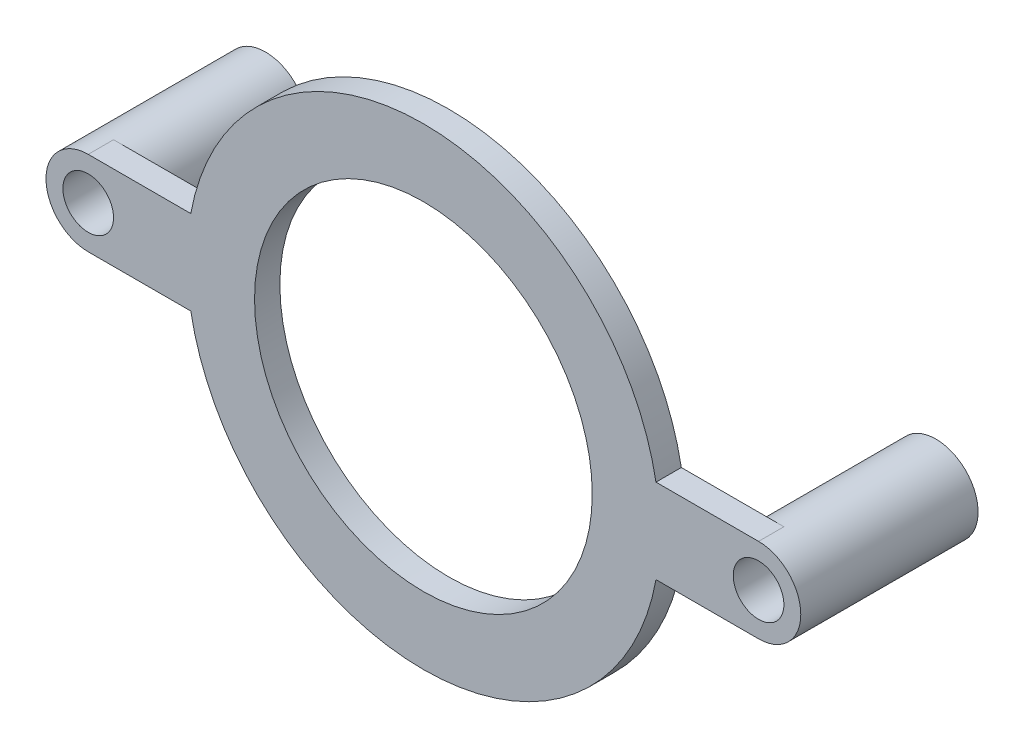
ISO-10303-21;
HEADER;
FILE_DESCRIPTION(('STEP AP214'),'2;1');
FILE_NAME('part.step','',(''),(''),'','','');
FILE_SCHEMA(('AUTOMOTIVE_DESIGN { 1 0 10303 214 1 1 1 1 }'));
ENDSEC;
DATA;
#1=APPLICATION_CONTEXT('core data for automotive mechanical design processes');
#2=APPLICATION_PROTOCOL_DEFINITION('international standard','automotive_design',2000,#1);
#3=PRODUCT_CONTEXT('',#1,'mechanical');
#4=PRODUCT('Part','Part','',(#3));
#5=PRODUCT_RELATED_PRODUCT_CATEGORY('part','',(#4));
#6=PRODUCT_DEFINITION_FORMATION('','',#4);
#7=PRODUCT_DEFINITION_CONTEXT('part definition',#1,'design');
#8=PRODUCT_DEFINITION('design','',#6,#7);
#9=PRODUCT_DEFINITION_SHAPE('','',#8);
#10=(LENGTH_UNIT() NAMED_UNIT(*) SI_UNIT(.MILLI.,.METRE.));
#11=(NAMED_UNIT(*) PLANE_ANGLE_UNIT() SI_UNIT($,.RADIAN.));
#12=(NAMED_UNIT(*) SI_UNIT($,.STERADIAN.) SOLID_ANGLE_UNIT());
#13=UNCERTAINTY_MEASURE_WITH_UNIT(LENGTH_MEASURE(1.E-05),#10,'distance_accuracy_value','');
#14=(GEOMETRIC_REPRESENTATION_CONTEXT(3) GLOBAL_UNCERTAINTY_ASSIGNED_CONTEXT((#13)) GLOBAL_UNIT_ASSIGNED_CONTEXT((#10,
#11,#12)) REPRESENTATION_CONTEXT('',''));
#15=CARTESIAN_POINT('',(0.,0.,0.));
#16=DIRECTION('',(0.,0.,1.));
#17=DIRECTION('',(1.,0.,0.));
#18=AXIS2_PLACEMENT_3D('',#15,#16,#17);
#19=CARTESIAN_POINT('',(19.85,0.,1.5));
#20=DIRECTION('',(0.,0.,-1.));
#21=DIRECTION('',(-1.,0.,0.));
#22=AXIS2_PLACEMENT_3D('',#19,#20,#21);
#23=CYLINDRICAL_SURFACE('',#22,2.5);
#24=DIRECTION('',(0.,0.,-1.));
#25=VECTOR('',#24,1.);
#26=CARTESIAN_POINT('',(19.85,-2.5,1.5));
#27=LINE('',#26,#25);
#28=CARTESIAN_POINT('',(19.85,-2.5,1.5));
#29=VERTEX_POINT('',#28);
#30=CARTESIAN_POINT('',(19.85,-2.5,0.));
#31=VERTEX_POINT('',#30);
#32=EDGE_CURVE('E115',#29,#31,#27,.T.);
#33=ORIENTED_EDGE('',*,*,#32,.T.);
#34=CARTESIAN_POINT('',(19.85,0.,0.));
#35=DIRECTION('',(0.,0.,-1.));
#36=DIRECTION('',(-1.,0.,0.));
#37=AXIS2_PLACEMENT_3D('',#34,#35,#36);
#38=CIRCLE('',#37,2.5);
#39=CARTESIAN_POINT('',(19.85,2.5,0.));
#40=VERTEX_POINT('',#39);
#41=EDGE_CURVE('E11',#31,#40,#38,.T.);
#42=ORIENTED_EDGE('',*,*,#41,.T.);
#43=DIRECTION('',(0.,0.,-1.));
#44=VECTOR('',#43,1.);
#45=CARTESIAN_POINT('',(19.85,2.5,1.5));
#46=LINE('',#45,#44);
#47=CARTESIAN_POINT('',(19.85,2.5,1.5));
#48=VERTEX_POINT('',#47);
#49=EDGE_CURVE('E107',#48,#40,#46,.T.);
#50=ORIENTED_EDGE('',*,*,#49,.F.);
#51=CARTESIAN_POINT('',(19.85,0.,1.5));
#52=DIRECTION('',(0.,0.,-1.));
#53=DIRECTION('',(-1.,0.,0.));
#54=AXIS2_PLACEMENT_3D('',#51,#52,#53);
#55=CIRCLE('',#54,2.5);
#56=EDGE_CURVE('E110',#48,#29,#55,.T.);
#57=ORIENTED_EDGE('',*,*,#56,.T.);
#58=EDGE_LOOP('',(#33,#42,#50,#57));
#59=FACE_BOUND('',#58,.T.);
#60=CARTESIAN_POINT('',(19.85,0.,-9.00000000000001));
#61=DIRECTION('',(0.,0.,-1.));
#62=DIRECTION('',(-1.,0.,0.));
#63=AXIS2_PLACEMENT_3D('',#60,#61,#62);
#64=CIRCLE('',#63,2.5);
#65=CARTESIAN_POINT('',(17.35,0.,-9.00000000000001));
#66=VERTEX_POINT('',#65);
#67=EDGE_CURVE('E170',#66,#66,#64,.T.);
#68=ORIENTED_EDGE('',*,*,#67,.F.);
#69=EDGE_LOOP('',(#68));
#70=FACE_BOUND('',#69,.T.);
#71=ADVANCED_FACE('F35',(#59,#70),#23,.T.);
#72=CARTESIAN_POINT('',(-19.85,0.,1.5));
#73=DIRECTION('',(0.,0.,-1.));
#74=DIRECTION('',(-1.,0.,0.));
#75=AXIS2_PLACEMENT_3D('',#72,#73,#74);
#76=CYLINDRICAL_SURFACE('',#75,2.5);
#77=DIRECTION('',(0.,0.,-1.));
#78=VECTOR('',#77,1.);
#79=CARTESIAN_POINT('',(-19.85,2.5,1.5));
#80=LINE('',#79,#78);
#81=CARTESIAN_POINT('',(-19.85,2.5,1.5));
#82=VERTEX_POINT('',#81);
#83=CARTESIAN_POINT('',(-19.85,2.5,0.));
#84=VERTEX_POINT('',#83);
#85=EDGE_CURVE('E157',#82,#84,#80,.T.);
#86=ORIENTED_EDGE('',*,*,#85,.T.);
#87=CARTESIAN_POINT('',(-19.85,0.,0.));
#88=DIRECTION('',(0.,0.,-1.));
#89=DIRECTION('',(-1.,0.,0.));
#90=AXIS2_PLACEMENT_3D('',#87,#88,#89);
#91=CIRCLE('',#90,2.5);
#92=CARTESIAN_POINT('',(-19.85,-2.5,0.));
#93=VERTEX_POINT('',#92);
#94=EDGE_CURVE('E138',#84,#93,#91,.T.);
#95=ORIENTED_EDGE('',*,*,#94,.T.);
#96=DIRECTION('',(0.,0.,-1.));
#97=VECTOR('',#96,1.);
#98=CARTESIAN_POINT('',(-19.85,-2.5,1.5));
#99=LINE('',#98,#97);
#100=CARTESIAN_POINT('',(-19.85,-2.5,1.5));
#101=VERTEX_POINT('',#100);
#102=EDGE_CURVE('E160',#101,#93,#99,.T.);
#103=ORIENTED_EDGE('',*,*,#102,.F.);
#104=CARTESIAN_POINT('',(-19.85,0.,1.5));
#105=DIRECTION('',(0.,0.,-1.));
#106=DIRECTION('',(-1.,0.,0.));
#107=AXIS2_PLACEMENT_3D('',#104,#105,#106);
#108=CIRCLE('',#107,2.5);
#109=EDGE_CURVE('E193',#101,#82,#108,.T.);
#110=ORIENTED_EDGE('',*,*,#109,.T.);
#111=EDGE_LOOP('',(#86,#95,#103,#110));
#112=FACE_BOUND('',#111,.T.);
#113=CARTESIAN_POINT('',(-19.85,0.,-9.00000000000001));
#114=DIRECTION('',(0.,0.,-1.));
#115=DIRECTION('',(-1.,0.,0.));
#116=AXIS2_PLACEMENT_3D('',#113,#114,#115);
#117=CIRCLE('',#116,2.5);
#118=CARTESIAN_POINT('',(-22.35,0.,-9.00000000000001));
#119=VERTEX_POINT('',#118);
#120=EDGE_CURVE('E164',#119,#119,#117,.T.);
#121=ORIENTED_EDGE('',*,*,#120,.F.);
#122=EDGE_LOOP('',(#121));
#123=FACE_BOUND('',#122,.T.);
#124=ADVANCED_FACE('F203',(#112,#123),#76,.T.);
#125=CARTESIAN_POINT('',(-19.85,0.,-22.));
#126=DIRECTION('',(0.,0.,-1.));
#127=DIRECTION('',(-1.,0.,0.));
#128=AXIS2_PLACEMENT_3D('',#125,#126,#127);
#129=CYLINDRICAL_SURFACE('',#128,1.49999999999999);
#130=CARTESIAN_POINT('',(-19.85,0.,1.5));
#131=DIRECTION('',(0.,0.,-1.));
#132=DIRECTION('',(-1.,0.,0.));
#133=AXIS2_PLACEMENT_3D('',#130,#131,#132);
#134=CIRCLE('',#133,1.49999999999999);
#135=CARTESIAN_POINT('',(-21.35,0.,1.5));
#136=VERTEX_POINT('',#135);
#137=EDGE_CURVE('E185',#136,#136,#134,.T.);
#138=ORIENTED_EDGE('',*,*,#137,.F.);
#139=EDGE_LOOP('',(#138));
#140=FACE_BOUND('',#139,.T.);
#141=CARTESIAN_POINT('',(-19.85,0.,-9.00000000000001));
#142=DIRECTION('',(0.,0.,-1.));
#143=DIRECTION('',(-1.,0.,0.));
#144=AXIS2_PLACEMENT_3D('',#141,#142,#143);
#145=CIRCLE('',#144,1.49999999999999);
#146=CARTESIAN_POINT('',(-21.35,0.,-9.00000000000001));
#147=VERTEX_POINT('',#146);
#148=EDGE_CURVE('E39',#147,#147,#145,.F.);
#149=ORIENTED_EDGE('',*,*,#148,.F.);
#150=EDGE_LOOP('',(#149));
#151=FACE_BOUND('',#150,.T.);
#152=ADVANCED_FACE('F224',(#140,#151),#129,.F.);
#153=CARTESIAN_POINT('',(19.85,0.,-22.));
#154=DIRECTION('',(0.,0.,-1.));
#155=DIRECTION('',(-1.,0.,0.));
#156=AXIS2_PLACEMENT_3D('',#153,#154,#155);
#157=CYLINDRICAL_SURFACE('',#156,1.49999999999999);
#158=CARTESIAN_POINT('',(19.85,0.,1.5));
#159=DIRECTION('',(0.,0.,-1.));
#160=DIRECTION('',(-1.,0.,0.));
#161=AXIS2_PLACEMENT_3D('',#158,#159,#160);
#162=CIRCLE('',#161,1.49999999999999);
#163=CARTESIAN_POINT('',(18.35,0.,1.5));
#164=VERTEX_POINT('',#163);
#165=EDGE_CURVE('E182',#164,#164,#162,.T.);
#166=ORIENTED_EDGE('',*,*,#165,.F.);
#167=EDGE_LOOP('',(#166));
#168=FACE_BOUND('',#167,.T.);
#169=CARTESIAN_POINT('',(19.85,0.,-9.00000000000001));
#170=DIRECTION('',(0.,0.,-1.));
#171=DIRECTION('',(-1.,0.,0.));
#172=AXIS2_PLACEMENT_3D('',#169,#170,#171);
#173=CIRCLE('',#172,1.49999999999999);
#174=CARTESIAN_POINT('',(18.35,0.,-9.00000000000001));
#175=VERTEX_POINT('',#174);
#176=EDGE_CURVE('E162',#175,#175,#173,.F.);
#177=ORIENTED_EDGE('',*,*,#176,.F.);
#178=EDGE_LOOP('',(#177));
#179=FACE_BOUND('',#178,.T.);
#180=ADVANCED_FACE('F249',(#168,#179),#157,.F.);
#181=CARTESIAN_POINT('',(0.,0.,0.));
#182=DIRECTION('',(0.,0.,-1.));
#183=DIRECTION('',(-1.,0.,0.));
#184=AXIS2_PLACEMENT_3D('',#181,#182,#183);
#185=PLANE('',#184);
#186=CARTESIAN_POINT('',(2.22044604925031E-13,0.,0.));
#187=DIRECTION('',(0.,0.,-1.));
#188=DIRECTION('',(-1.,0.,0.));
#189=AXIS2_PLACEMENT_3D('',#186,#187,#188);
#190=CIRCLE('',#189,9.99999999999977);
#191=CARTESIAN_POINT('',(-9.99999999999954,0.,0.));
#192=VERTEX_POINT('',#191);
#193=EDGE_CURVE('E179',#192,#192,#190,.T.);
#194=ORIENTED_EDGE('',*,*,#193,.F.);
#195=EDGE_LOOP('',(#194));
#196=FACE_BOUND('',#195,.T.);
#197=DIRECTION('',(-1.,0.,0.));
#198=VECTOR('',#197,1.);
#199=CARTESIAN_POINT('',(-13.7749773139559,-2.5,0.));
#200=LINE('',#199,#198);
#201=CARTESIAN_POINT('',(-13.7749773139559,-2.5,0.));
#202=VERTEX_POINT('',#201);
#203=EDGE_CURVE('E137',#202,#93,#200,.T.);
#204=ORIENTED_EDGE('',*,*,#203,.T.);
#205=ORIENTED_EDGE('',*,*,#94,.F.);
#206=DIRECTION('',(1.,0.,0.));
#207=VECTOR('',#206,1.);
#208=CARTESIAN_POINT('',(-19.85,2.5,0.));
#209=LINE('',#208,#207);
#210=CARTESIAN_POINT('',(-13.7749773139559,2.5,0.));
#211=VERTEX_POINT('',#210);
#212=EDGE_CURVE('E141',#84,#211,#209,.T.);
#213=ORIENTED_EDGE('',*,*,#212,.T.);
#214=CARTESIAN_POINT('',(0.,0.,0.));
#215=DIRECTION('',(0.,0.,-1.));
#216=DIRECTION('',(-1.,0.,0.));
#217=AXIS2_PLACEMENT_3D('',#214,#215,#216);
#218=CIRCLE('',#217,14.);
#219=CARTESIAN_POINT('',(13.7749773139559,2.5,0.));
#220=VERTEX_POINT('',#219);
#221=EDGE_CURVE('E144',#211,#220,#218,.T.);
#222=ORIENTED_EDGE('',*,*,#221,.T.);
#223=DIRECTION('',(1.,0.,0.));
#224=VECTOR('',#223,1.);
#225=CARTESIAN_POINT('',(13.7749773139559,2.5,0.));
#226=LINE('',#225,#224);
#227=EDGE_CURVE('E147',#220,#40,#226,.T.);
#228=ORIENTED_EDGE('',*,*,#227,.T.);
#229=ORIENTED_EDGE('',*,*,#41,.F.);
#230=DIRECTION('',(-1.,0.,0.));
#231=VECTOR('',#230,1.);
#232=CARTESIAN_POINT('',(19.85,-2.5,0.));
#233=LINE('',#232,#231);
#234=CARTESIAN_POINT('',(13.7749773139559,-2.5,0.));
#235=VERTEX_POINT('',#234);
#236=EDGE_CURVE('E149',#31,#235,#233,.T.);
#237=ORIENTED_EDGE('',*,*,#236,.T.);
#238=CARTESIAN_POINT('',(0.,0.,0.));
#239=DIRECTION('',(0.,0.,-1.));
#240=DIRECTION('',(-1.,0.,0.));
#241=AXIS2_PLACEMENT_3D('',#238,#239,#240);
#242=CIRCLE('',#241,14.);
#243=EDGE_CURVE('E134',#235,#202,#242,.T.);
#244=ORIENTED_EDGE('',*,*,#243,.T.);
#245=EDGE_LOOP('',(#204,#205,#213,#222,#228,#229,#237,#244));
#246=FACE_BOUND('',#245,.T.);
#247=ADVANCED_FACE('F208',(#196,#246),#185,.T.);
#248=CARTESIAN_POINT('',(0.,0.,1.5));
#249=DIRECTION('',(0.,0.,-1.));
#250=DIRECTION('',(-1.,0.,0.));
#251=AXIS2_PLACEMENT_3D('',#248,#249,#250);
#252=CYLINDRICAL_SURFACE('',#251,14.);
#253=ORIENTED_EDGE('',*,*,#243,.F.);
#254=DIRECTION('',(0.,0.,-1.));
#255=VECTOR('',#254,1.);
#256=CARTESIAN_POINT('',(13.7749773139559,-2.5,1.5));
#257=LINE('',#256,#255);
#258=CARTESIAN_POINT('',(13.7749773139559,-2.5,1.5));
#259=VERTEX_POINT('',#258);
#260=EDGE_CURVE('E45',#259,#235,#257,.T.);
#261=ORIENTED_EDGE('',*,*,#260,.F.);
#262=CARTESIAN_POINT('',(0.,0.,1.5));
#263=DIRECTION('',(0.,0.,-1.));
#264=DIRECTION('',(-1.,0.,0.));
#265=AXIS2_PLACEMENT_3D('',#262,#263,#264);
#266=CIRCLE('',#265,14.);
#267=CARTESIAN_POINT('',(-13.7749773139559,-2.5,1.5));
#268=VERTEX_POINT('',#267);
#269=EDGE_CURVE('E151',#259,#268,#266,.T.);
#270=ORIENTED_EDGE('',*,*,#269,.T.);
#271=DIRECTION('',(0.,0.,-1.));
#272=VECTOR('',#271,1.);
#273=CARTESIAN_POINT('',(-13.7749773139559,-2.5,1.5));
#274=LINE('',#273,#272);
#275=EDGE_CURVE('E88',#268,#202,#274,.T.);
#276=ORIENTED_EDGE('',*,*,#275,.T.);
#277=EDGE_LOOP('',(#253,#261,#270,#276));
#278=FACE_BOUND('',#277,.T.);
#279=ADVANCED_FACE('F37',(#278),#252,.T.);
#280=CARTESIAN_POINT('',(19.85,-2.5,1.5));
#281=DIRECTION('',(0.,-1.,0.));
#282=DIRECTION('',(0.,0.,-1.));
#283=AXIS2_PLACEMENT_3D('',#280,#281,#282);
#284=PLANE('',#283);
#285=ORIENTED_EDGE('',*,*,#236,.F.);
#286=ORIENTED_EDGE('',*,*,#32,.F.);
#287=DIRECTION('',(-1.,0.,0.));
#288=VECTOR('',#287,1.);
#289=CARTESIAN_POINT('',(19.85,-2.5,1.5));
#290=LINE('',#289,#288);
#291=EDGE_CURVE('E124',#29,#259,#290,.T.);
#292=ORIENTED_EDGE('',*,*,#291,.T.);
#293=ORIENTED_EDGE('',*,*,#260,.T.);
#294=EDGE_LOOP('',(#285,#286,#292,#293));
#295=FACE_BOUND('',#294,.T.);
#296=ADVANCED_FACE('F209',(#295),#284,.T.);
#297=CARTESIAN_POINT('',(13.7749773139559,2.5,1.5));
#298=DIRECTION('',(0.,1.,0.));
#299=DIRECTION('',(0.,0.,1.));
#300=AXIS2_PLACEMENT_3D('',#297,#298,#299);
#301=PLANE('',#300);
#302=ORIENTED_EDGE('',*,*,#227,.F.);
#303=DIRECTION('',(0.,0.,-1.));
#304=VECTOR('',#303,1.);
#305=CARTESIAN_POINT('',(13.7749773139559,2.5,1.5));
#306=LINE('',#305,#304);
#307=CARTESIAN_POINT('',(13.7749773139559,2.5,1.5));
#308=VERTEX_POINT('',#307);
#309=EDGE_CURVE('E116',#308,#220,#306,.T.);
#310=ORIENTED_EDGE('',*,*,#309,.F.);
#311=DIRECTION('',(1.,0.,0.));
#312=VECTOR('',#311,1.);
#313=CARTESIAN_POINT('',(13.7749773139559,2.5,1.5));
#314=LINE('',#313,#312);
#315=EDGE_CURVE('E122',#308,#48,#314,.T.);
#316=ORIENTED_EDGE('',*,*,#315,.T.);
#317=ORIENTED_EDGE('',*,*,#49,.T.);
#318=EDGE_LOOP('',(#302,#310,#316,#317));
#319=FACE_BOUND('',#318,.T.);
#320=ADVANCED_FACE('F126',(#319),#301,.T.);
#321=CARTESIAN_POINT('',(0.,0.,1.5));
#322=DIRECTION('',(0.,0.,-1.));
#323=DIRECTION('',(-1.,0.,0.));
#324=AXIS2_PLACEMENT_3D('',#321,#322,#323);
#325=CYLINDRICAL_SURFACE('',#324,14.);
#326=ORIENTED_EDGE('',*,*,#221,.F.);
#327=DIRECTION('',(0.,0.,-1.));
#328=VECTOR('',#327,1.);
#329=CARTESIAN_POINT('',(-13.7749773139559,2.5,1.5));
#330=LINE('',#329,#328);
#331=CARTESIAN_POINT('',(-13.7749773139559,2.5,1.5));
#332=VERTEX_POINT('',#331);
#333=EDGE_CURVE('E155',#332,#211,#330,.T.);
#334=ORIENTED_EDGE('',*,*,#333,.F.);
#335=CARTESIAN_POINT('',(0.,0.,1.5));
#336=DIRECTION('',(0.,0.,-1.));
#337=DIRECTION('',(-1.,0.,0.));
#338=AXIS2_PLACEMENT_3D('',#335,#336,#337);
#339=CIRCLE('',#338,14.);
#340=EDGE_CURVE('E127',#332,#308,#339,.T.);
#341=ORIENTED_EDGE('',*,*,#340,.T.);
#342=ORIENTED_EDGE('',*,*,#309,.T.);
#343=EDGE_LOOP('',(#326,#334,#341,#342));
#344=FACE_BOUND('',#343,.T.);
#345=ADVANCED_FACE('F216',(#344),#325,.T.);
#346=CARTESIAN_POINT('',(-19.85,2.5,1.5));
#347=DIRECTION('',(0.,1.,0.));
#348=DIRECTION('',(-1.,0.,0.));
#349=AXIS2_PLACEMENT_3D('',#346,#347,#348);
#350=PLANE('',#349);
#351=ORIENTED_EDGE('',*,*,#212,.F.);
#352=ORIENTED_EDGE('',*,*,#85,.F.);
#353=DIRECTION('',(1.,0.,0.));
#354=VECTOR('',#353,1.);
#355=CARTESIAN_POINT('',(-19.85,2.5,1.5));
#356=LINE('',#355,#354);
#357=EDGE_CURVE('E129',#82,#332,#356,.T.);
#358=ORIENTED_EDGE('',*,*,#357,.T.);
#359=ORIENTED_EDGE('',*,*,#333,.T.);
#360=EDGE_LOOP('',(#351,#352,#358,#359));
#361=FACE_BOUND('',#360,.T.);
#362=ADVANCED_FACE('F199',(#361),#350,.T.);
#363=CARTESIAN_POINT('',(-13.7749773139559,-2.5,1.5));
#364=DIRECTION('',(0.,-1.,0.));
#365=DIRECTION('',(0.,0.,-1.));
#366=AXIS2_PLACEMENT_3D('',#363,#364,#365);
#367=PLANE('',#366);
#368=ORIENTED_EDGE('',*,*,#203,.F.);
#369=ORIENTED_EDGE('',*,*,#275,.F.);
#370=DIRECTION('',(-1.,0.,0.));
#371=VECTOR('',#370,1.);
#372=CARTESIAN_POINT('',(-13.7749773139559,-2.5,1.5));
#373=LINE('',#372,#371);
#374=EDGE_CURVE('E191',#268,#101,#373,.T.);
#375=ORIENTED_EDGE('',*,*,#374,.T.);
#376=ORIENTED_EDGE('',*,*,#102,.T.);
#377=EDGE_LOOP('',(#368,#369,#375,#376));
#378=FACE_BOUND('',#377,.T.);
#379=ADVANCED_FACE('F207',(#378),#367,.T.);
#380=CARTESIAN_POINT('',(0.,0.,1.5));
#381=DIRECTION('',(0.,0.,-1.));
#382=DIRECTION('',(-1.,0.,0.));
#383=AXIS2_PLACEMENT_3D('',#380,#381,#382);
#384=PLANE('',#383);
#385=CARTESIAN_POINT('',(2.22044604925031E-13,0.,1.5));
#386=DIRECTION('',(0.,0.,1.));
#387=DIRECTION('',(1.,0.,0.));
#388=AXIS2_PLACEMENT_3D('',#385,#386,#387);
#389=CIRCLE('',#388,9.99999999999977);
#390=CARTESIAN_POINT('',(9.99999999999999,0.,1.5));
#391=VERTEX_POINT('',#390);
#392=EDGE_CURVE('E168',#391,#391,#389,.T.);
#393=ORIENTED_EDGE('',*,*,#392,.F.);
#394=EDGE_LOOP('',(#393));
#395=FACE_BOUND('',#394,.T.);
#396=ORIENTED_EDGE('',*,*,#165,.T.);
#397=EDGE_LOOP('',(#396));
#398=FACE_BOUND('',#397,.T.);
#399=ORIENTED_EDGE('',*,*,#137,.T.);
#400=EDGE_LOOP('',(#399));
#401=FACE_BOUND('',#400,.T.);
#402=ORIENTED_EDGE('',*,*,#269,.F.);
#403=ORIENTED_EDGE('',*,*,#291,.F.);
#404=ORIENTED_EDGE('',*,*,#56,.F.);
#405=ORIENTED_EDGE('',*,*,#315,.F.);
#406=ORIENTED_EDGE('',*,*,#340,.F.);
#407=ORIENTED_EDGE('',*,*,#357,.F.);
#408=ORIENTED_EDGE('',*,*,#109,.F.);
#409=ORIENTED_EDGE('',*,*,#374,.F.);
#410=EDGE_LOOP('',(#402,#403,#404,#405,#406,#407,#408,#409));
#411=FACE_BOUND('',#410,.T.);
#412=ADVANCED_FACE('F120',(#395,#398,#401,#411),#384,.F.);
#413=CARTESIAN_POINT('',(2.22044604925031E-13,0.,1.5));
#414=DIRECTION('',(0.,0.,1.));
#415=DIRECTION('',(1.,0.,0.));
#416=AXIS2_PLACEMENT_3D('',#413,#414,#415);
#417=CYLINDRICAL_SURFACE('',#416,9.99999999999977);
#418=ORIENTED_EDGE('',*,*,#193,.T.);
#419=EDGE_LOOP('',(#418));
#420=FACE_BOUND('',#419,.T.);
#421=ORIENTED_EDGE('',*,*,#392,.T.);
#422=EDGE_LOOP('',(#421));
#423=FACE_BOUND('',#422,.T.);
#424=ADVANCED_FACE('F235',(#420,#423),#417,.F.);
#425=CARTESIAN_POINT('',(19.85,0.,-9.00000000000001));
#426=DIRECTION('',(0.,0.,-1.));
#427=DIRECTION('',(-1.,0.,0.));
#428=AXIS2_PLACEMENT_3D('',#425,#426,#427);
#429=PLANE('',#428);
#430=ORIENTED_EDGE('',*,*,#67,.T.);
#431=EDGE_LOOP('',(#430));
#432=FACE_BOUND('',#431,.T.);
#433=ORIENTED_EDGE('',*,*,#176,.T.);
#434=EDGE_LOOP('',(#433));
#435=FACE_BOUND('',#434,.T.);
#436=ADVANCED_FACE('F241',(#432,#435),#429,.T.);
#437=CARTESIAN_POINT('',(-19.85,0.,-9.00000000000001));
#438=DIRECTION('',(0.,0.,-1.));
#439=DIRECTION('',(-1.,0.,0.));
#440=AXIS2_PLACEMENT_3D('',#437,#438,#439);
#441=PLANE('',#440);
#442=ORIENTED_EDGE('',*,*,#120,.T.);
#443=EDGE_LOOP('',(#442));
#444=FACE_BOUND('',#443,.T.);
#445=ORIENTED_EDGE('',*,*,#148,.T.);
#446=EDGE_LOOP('',(#445));
#447=FACE_BOUND('',#446,.T.);
#448=ADVANCED_FACE('F266',(#444,#447),#441,.T.);
#449=CLOSED_SHELL('',(#71,#124,#152,#180,#247,#279,#296,#320,#345,#362,#379,#412,#424,#436,#448));
#450=MANIFOLD_SOLID_BREP('B2',#449);
#451=ADVANCED_BREP_SHAPE_REPRESENTATION('',(#18,#450),#14);
#452=SHAPE_DEFINITION_REPRESENTATION(#9,#451);
ENDSEC;
END-ISO-10303-21;
